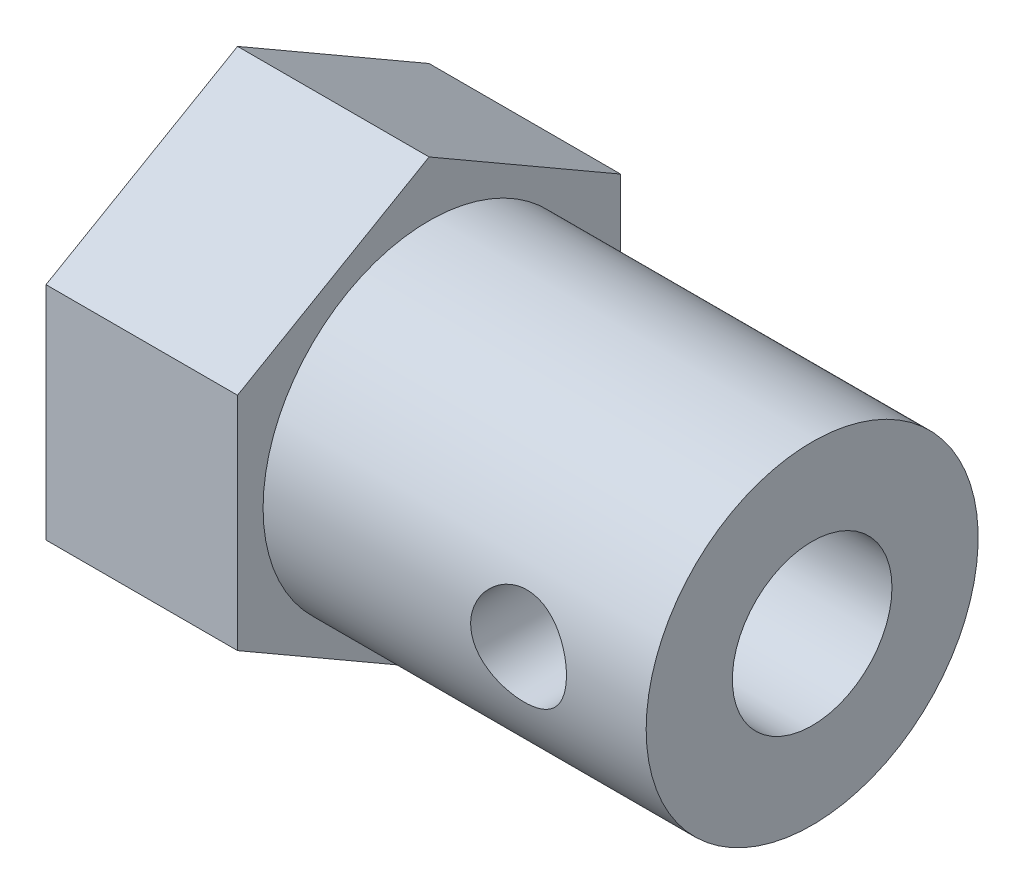
ISO-10303-21;
HEADER;
FILE_DESCRIPTION(('STEP AP214'),'2;1');
FILE_NAME('part.step','',(''),(''),'','','');
FILE_SCHEMA(('AUTOMOTIVE_DESIGN { 1 0 10303 214 1 1 1 1 }'));
ENDSEC;
DATA;
#1=APPLICATION_CONTEXT('core data for automotive mechanical design processes');
#2=APPLICATION_PROTOCOL_DEFINITION('international standard','automotive_design',2000,#1);
#3=PRODUCT_CONTEXT('',#1,'mechanical');
#4=PRODUCT('Part','Part','',(#3));
#5=PRODUCT_RELATED_PRODUCT_CATEGORY('part','',(#4));
#6=PRODUCT_DEFINITION_FORMATION('','',#4);
#7=PRODUCT_DEFINITION_CONTEXT('part definition',#1,'design');
#8=PRODUCT_DEFINITION('design','',#6,#7);
#9=PRODUCT_DEFINITION_SHAPE('','',#8);
#10=(LENGTH_UNIT() NAMED_UNIT(*) SI_UNIT(.MILLI.,.METRE.));
#11=(NAMED_UNIT(*) PLANE_ANGLE_UNIT() SI_UNIT($,.RADIAN.));
#12=(NAMED_UNIT(*) SI_UNIT($,.STERADIAN.) SOLID_ANGLE_UNIT());
#13=UNCERTAINTY_MEASURE_WITH_UNIT(LENGTH_MEASURE(1.E-05),#10,'distance_accuracy_value','');
#14=(GEOMETRIC_REPRESENTATION_CONTEXT(3) GLOBAL_UNCERTAINTY_ASSIGNED_CONTEXT((#13)) GLOBAL_UNIT_ASSIGNED_CONTEXT((#10,
#11,#12)) REPRESENTATION_CONTEXT('',''));
#15=CARTESIAN_POINT('',(0.,0.,0.));
#16=DIRECTION('',(0.,0.,1.));
#17=DIRECTION('',(1.,0.,0.));
#18=AXIS2_PLACEMENT_3D('',#15,#16,#17);
#19=CARTESIAN_POINT('',(-82.,-73.4641016151378,-39.5));
#20=DIRECTION('',(0.,-0.86602540378444,-0.499999999999997));
#21=DIRECTION('',(0.,0.499999999999997,-0.86602540378444));
#22=AXIS2_PLACEMENT_3D('',#19,#20,#21);
#23=PLANE('',#22);
#24=DIRECTION('',(0.,-0.499999999999997,0.86602540378444));
#25=VECTOR('',#24,1.);
#26=CARTESIAN_POINT('',(-88.,-73.4641016151378,-39.5));
#27=LINE('',#26,#25);
#28=CARTESIAN_POINT('',(-88.,-73.4641016151378,-39.5));
#29=VERTEX_POINT('',#28);
#30=CARTESIAN_POINT('',(-88.,-76.9282032302755,-33.5));
#31=VERTEX_POINT('',#30);
#32=EDGE_CURVE('E122',#29,#31,#27,.T.);
#33=ORIENTED_EDGE('',*,*,#32,.F.);
#34=DIRECTION('',(-1.,0.,0.));
#35=VECTOR('',#34,1.);
#36=CARTESIAN_POINT('',(-82.,-73.4641016151378,-39.5));
#37=LINE('',#36,#35);
#38=CARTESIAN_POINT('',(-82.,-73.4641016151378,-39.5));
#39=VERTEX_POINT('',#38);
#40=EDGE_CURVE('E11',#39,#29,#37,.T.);
#41=ORIENTED_EDGE('',*,*,#40,.F.);
#42=DIRECTION('',(0.,-0.499999999999997,0.86602540378444));
#43=VECTOR('',#42,1.);
#44=CARTESIAN_POINT('',(-82.,-73.4641016151378,-39.5));
#45=LINE('',#44,#43);
#46=CARTESIAN_POINT('',(-82.,-76.9282032302755,-33.5));
#47=VERTEX_POINT('',#46);
#48=EDGE_CURVE('E137',#39,#47,#45,.T.);
#49=ORIENTED_EDGE('',*,*,#48,.T.);
#50=DIRECTION('',(-1.,0.,0.));
#51=VECTOR('',#50,1.);
#52=CARTESIAN_POINT('',(-82.,-76.9282032302755,-33.5));
#53=LINE('',#52,#51);
#54=EDGE_CURVE('E86',#47,#31,#53,.T.);
#55=ORIENTED_EDGE('',*,*,#54,.T.);
#56=EDGE_LOOP('',(#33,#41,#49,#55));
#57=FACE_BOUND('',#56,.T.);
#58=ADVANCED_FACE('F32',(#57),#23,.T.);
#59=CARTESIAN_POINT('',(-82.,-66.5358983848623,-39.5));
#60=DIRECTION('',(0.,0.,-1.));
#61=DIRECTION('',(0.,1.,0.));
#62=AXIS2_PLACEMENT_3D('',#59,#60,#61);
#63=PLANE('',#62);
#64=DIRECTION('',(0.,-1.,0.));
#65=VECTOR('',#64,1.);
#66=CARTESIAN_POINT('',(-88.,-66.5358983848623,-39.5));
#67=LINE('',#66,#65);
#68=CARTESIAN_POINT('',(-88.,-66.5358983848623,-39.5));
#69=VERTEX_POINT('',#68);
#70=EDGE_CURVE('E135',#69,#29,#67,.T.);
#71=ORIENTED_EDGE('',*,*,#70,.F.);
#72=DIRECTION('',(-1.,0.,0.));
#73=VECTOR('',#72,1.);
#74=CARTESIAN_POINT('',(-82.,-66.5358983848623,-39.5));
#75=LINE('',#74,#73);
#76=CARTESIAN_POINT('',(-82.,-66.5358983848623,-39.5));
#77=VERTEX_POINT('',#76);
#78=EDGE_CURVE('E45',#77,#69,#75,.T.);
#79=ORIENTED_EDGE('',*,*,#78,.F.);
#80=DIRECTION('',(0.,-1.,0.));
#81=VECTOR('',#80,1.);
#82=CARTESIAN_POINT('',(-82.,-66.5358983848623,-39.5));
#83=LINE('',#82,#81);
#84=EDGE_CURVE('E112',#77,#39,#83,.T.);
#85=ORIENTED_EDGE('',*,*,#84,.T.);
#86=ORIENTED_EDGE('',*,*,#40,.T.);
#87=EDGE_LOOP('',(#71,#79,#85,#86));
#88=FACE_BOUND('',#87,.T.);
#89=ADVANCED_FACE('F146',(#88),#63,.T.);
#90=CARTESIAN_POINT('',(-82.,-63.0717967697245,-33.5));
#91=DIRECTION('',(0.,0.866025403784437,-0.500000000000003));
#92=DIRECTION('',(0.,0.500000000000003,0.866025403784437));
#93=AXIS2_PLACEMENT_3D('',#90,#91,#92);
#94=PLANE('',#93);
#95=DIRECTION('',(0.,-0.500000000000002,-0.866025403784437));
#96=VECTOR('',#95,1.);
#97=CARTESIAN_POINT('',(-88.,-63.0717967697245,-33.5));
#98=LINE('',#97,#96);
#99=CARTESIAN_POINT('',(-88.,-63.0717967697245,-33.5));
#100=VERTEX_POINT('',#99);
#101=EDGE_CURVE('E99',#100,#69,#98,.T.);
#102=ORIENTED_EDGE('',*,*,#101,.F.);
#103=DIRECTION('',(-1.,0.,0.));
#104=VECTOR('',#103,1.);
#105=CARTESIAN_POINT('',(-82.,-63.0717967697245,-33.5));
#106=LINE('',#105,#104);
#107=CARTESIAN_POINT('',(-82.,-63.0717967697245,-33.5));
#108=VERTEX_POINT('',#107);
#109=EDGE_CURVE('E94',#108,#100,#106,.T.);
#110=ORIENTED_EDGE('',*,*,#109,.F.);
#111=DIRECTION('',(0.,-0.500000000000002,-0.866025403784437));
#112=VECTOR('',#111,1.);
#113=CARTESIAN_POINT('',(-82.,-63.0717967697245,-33.5));
#114=LINE('',#113,#112);
#115=EDGE_CURVE('E97',#108,#77,#114,.T.);
#116=ORIENTED_EDGE('',*,*,#115,.T.);
#117=ORIENTED_EDGE('',*,*,#78,.T.);
#118=EDGE_LOOP('',(#102,#110,#116,#117));
#119=FACE_BOUND('',#118,.T.);
#120=ADVANCED_FACE('F96',(#119),#94,.T.);
#121=CARTESIAN_POINT('',(-82.,-66.5358983848623,-27.5));
#122=DIRECTION('',(0.,0.866025403784438,0.500000000000001));
#123=DIRECTION('',(0.,-0.500000000000001,0.866025403784438));
#124=AXIS2_PLACEMENT_3D('',#121,#122,#123);
#125=PLANE('',#124);
#126=DIRECTION('',(0.,0.500000000000001,-0.866025403784438));
#127=VECTOR('',#126,1.);
#128=CARTESIAN_POINT('',(-88.,-66.5358983848623,-27.5));
#129=LINE('',#128,#127);
#130=CARTESIAN_POINT('',(-88.,-66.5358983848623,-27.5));
#131=VERTEX_POINT('',#130);
#132=EDGE_CURVE('E132',#131,#100,#129,.T.);
#133=ORIENTED_EDGE('',*,*,#132,.F.);
#134=DIRECTION('',(-1.,0.,0.));
#135=VECTOR('',#134,1.);
#136=CARTESIAN_POINT('',(-82.,-66.5358983848623,-27.5));
#137=LINE('',#136,#135);
#138=CARTESIAN_POINT('',(-82.,-66.5358983848623,-27.5));
#139=VERTEX_POINT('',#138);
#140=EDGE_CURVE('E104',#139,#131,#137,.T.);
#141=ORIENTED_EDGE('',*,*,#140,.F.);
#142=DIRECTION('',(0.,0.500000000000001,-0.866025403784438));
#143=VECTOR('',#142,1.);
#144=CARTESIAN_POINT('',(-82.,-66.5358983848623,-27.5));
#145=LINE('',#144,#143);
#146=EDGE_CURVE('E110',#139,#108,#145,.T.);
#147=ORIENTED_EDGE('',*,*,#146,.T.);
#148=ORIENTED_EDGE('',*,*,#109,.T.);
#149=EDGE_LOOP('',(#133,#141,#147,#148));
#150=FACE_BOUND('',#149,.T.);
#151=ADVANCED_FACE('F114',(#150),#125,.T.);
#152=CARTESIAN_POINT('',(-82.,-73.4641016151378,-27.5));
#153=DIRECTION('',(0.,0.,1.));
#154=DIRECTION('',(0.,-1.,0.));
#155=AXIS2_PLACEMENT_3D('',#152,#153,#154);
#156=PLANE('',#155);
#157=DIRECTION('',(0.,1.,0.));
#158=VECTOR('',#157,1.);
#159=CARTESIAN_POINT('',(-88.,-73.4641016151378,-27.5));
#160=LINE('',#159,#158);
#161=CARTESIAN_POINT('',(-88.,-73.4641016151378,-27.5));
#162=VERTEX_POINT('',#161);
#163=EDGE_CURVE('E129',#162,#131,#160,.T.);
#164=ORIENTED_EDGE('',*,*,#163,.F.);
#165=DIRECTION('',(-1.,0.,0.));
#166=VECTOR('',#165,1.);
#167=CARTESIAN_POINT('',(-82.,-73.4641016151378,-27.5));
#168=LINE('',#167,#166);
#169=CARTESIAN_POINT('',(-82.,-73.4641016151378,-27.5));
#170=VERTEX_POINT('',#169);
#171=EDGE_CURVE('E141',#170,#162,#168,.T.);
#172=ORIENTED_EDGE('',*,*,#171,.F.);
#173=DIRECTION('',(0.,1.,0.));
#174=VECTOR('',#173,1.);
#175=CARTESIAN_POINT('',(-82.,-73.4641016151378,-27.5));
#176=LINE('',#175,#174);
#177=EDGE_CURVE('E115',#170,#139,#176,.T.);
#178=ORIENTED_EDGE('',*,*,#177,.T.);
#179=ORIENTED_EDGE('',*,*,#140,.T.);
#180=EDGE_LOOP('',(#164,#172,#178,#179));
#181=FACE_BOUND('',#180,.T.);
#182=ADVANCED_FACE('F159',(#181),#156,.T.);
#183=CARTESIAN_POINT('',(-82.,-76.9282032302755,-33.5));
#184=DIRECTION('',(0.,-0.866025403784441,0.499999999999996));
#185=DIRECTION('',(0.,-0.499999999999996,-0.866025403784441));
#186=AXIS2_PLACEMENT_3D('',#183,#184,#185);
#187=PLANE('',#186);
#188=DIRECTION('',(0.,0.499999999999996,0.866025403784441));
#189=VECTOR('',#188,1.);
#190=CARTESIAN_POINT('',(-88.,-76.9282032302755,-33.5));
#191=LINE('',#190,#189);
#192=EDGE_CURVE('E125',#31,#162,#191,.T.);
#193=ORIENTED_EDGE('',*,*,#192,.F.);
#194=ORIENTED_EDGE('',*,*,#54,.F.);
#195=DIRECTION('',(0.,0.499999999999996,0.866025403784441));
#196=VECTOR('',#195,1.);
#197=CARTESIAN_POINT('',(-82.,-76.9282032302755,-33.5));
#198=LINE('',#197,#196);
#199=EDGE_CURVE('E117',#47,#170,#198,.T.);
#200=ORIENTED_EDGE('',*,*,#199,.T.);
#201=ORIENTED_EDGE('',*,*,#171,.T.);
#202=EDGE_LOOP('',(#193,#194,#200,#201));
#203=FACE_BOUND('',#202,.T.);
#204=ADVANCED_FACE('F142',(#203),#187,.T.);
#205=CARTESIAN_POINT('',(-82.,0.,0.));
#206=DIRECTION('',(-1.,0.,0.));
#207=DIRECTION('',(0.,0.,1.));
#208=AXIS2_PLACEMENT_3D('',#205,#206,#207);
#209=PLANE('',#208);
#210=CARTESIAN_POINT('',(-82.,-70.,-33.5));
#211=DIRECTION('',(-1.,0.,0.));
#212=DIRECTION('',(0.,0.,1.));
#213=AXIS2_PLACEMENT_3D('',#210,#211,#212);
#214=CIRCLE('',#213,5.2);
#215=CARTESIAN_POINT('',(-82.,-70.,-28.3));
#216=VERTEX_POINT('',#215);
#217=EDGE_CURVE('E217',#216,#216,#214,.T.);
#218=ORIENTED_EDGE('',*,*,#217,.T.);
#219=EDGE_LOOP('',(#218));
#220=FACE_BOUND('',#219,.T.);
#221=ORIENTED_EDGE('',*,*,#48,.F.);
#222=ORIENTED_EDGE('',*,*,#84,.F.);
#223=ORIENTED_EDGE('',*,*,#115,.F.);
#224=ORIENTED_EDGE('',*,*,#146,.F.);
#225=ORIENTED_EDGE('',*,*,#177,.F.);
#226=ORIENTED_EDGE('',*,*,#199,.F.);
#227=EDGE_LOOP('',(#221,#222,#223,#224,#225,#226));
#228=FACE_BOUND('',#227,.T.);
#229=ADVANCED_FACE('F108',(#220,#228),#209,.F.);
#230=CARTESIAN_POINT('',(-88.,0.,0.));
#231=DIRECTION('',(-1.,0.,0.));
#232=DIRECTION('',(0.,0.,1.));
#233=AXIS2_PLACEMENT_3D('',#230,#231,#232);
#234=PLANE('',#233);
#235=CARTESIAN_POINT('',(-88.,-70.,-33.5));
#236=DIRECTION('',(1.,0.,0.));
#237=DIRECTION('',(0.,0.,-1.));
#238=AXIS2_PLACEMENT_3D('',#235,#236,#237);
#239=CIRCLE('',#238,2.);
#240=CARTESIAN_POINT('',(-88.,-70.,-35.5));
#241=VERTEX_POINT('',#240);
#242=EDGE_CURVE('E211',#241,#241,#239,.T.);
#243=ORIENTED_EDGE('',*,*,#242,.T.);
#244=EDGE_LOOP('',(#243));
#245=FACE_BOUND('',#244,.T.);
#246=ORIENTED_EDGE('',*,*,#32,.T.);
#247=ORIENTED_EDGE('',*,*,#192,.T.);
#248=ORIENTED_EDGE('',*,*,#163,.T.);
#249=ORIENTED_EDGE('',*,*,#132,.T.);
#250=ORIENTED_EDGE('',*,*,#101,.T.);
#251=ORIENTED_EDGE('',*,*,#70,.T.);
#252=EDGE_LOOP('',(#246,#247,#248,#249,#250,#251));
#253=FACE_BOUND('',#252,.T.);
#254=ADVANCED_FACE('F145',(#245,#253),#234,.T.);
#255=CARTESIAN_POINT('',(-70.,-70.,-33.5));
#256=DIRECTION('',(-1.,0.,0.));
#257=DIRECTION('',(0.,0.,1.));
#258=AXIS2_PLACEMENT_3D('',#255,#256,#257);
#259=CYLINDRICAL_SURFACE('',#258,5.2);
#260=CARTESIAN_POINT('',(-72.5075734128847,-70.,-28.3));
#261=CARTESIAN_POINT('',(-72.4993298792375,-69.9182634320137,-28.3000009519643));
#262=CARTESIAN_POINT('',(-72.4978193369039,-69.8358344879732,-28.3019457847133));
#263=CARTESIAN_POINT('',(-72.5082716435564,-69.6720088682041,-28.3097058460094));
#264=CARTESIAN_POINT('',(-72.5202383669136,-69.5906124961177,-28.3155221873202));
#265=CARTESIAN_POINT('',(-72.5571550520366,-69.4312727250517,-28.3305755782491));
#266=CARTESIAN_POINT('',(-72.5820883933892,-69.3533250440489,-28.3398082445139));
#267=CARTESIAN_POINT('',(-72.6440961947241,-69.2028101877803,-28.3609075797076));
#268=CARTESIAN_POINT('',(-72.6811721135689,-69.1302436603152,-28.3727745650798));
#269=CARTESIAN_POINT('',(-72.767395763415,-68.9906363829018,-28.3983979813537));
#270=CARTESIAN_POINT('',(-72.8168053804033,-68.9237644177519,-28.4121920895569));
#271=CARTESIAN_POINT('',(-72.9259265277117,-68.7991099694335,-28.4401629153205));
#272=CARTESIAN_POINT('',(-72.9856403544675,-68.7413295179341,-28.4543397175743));
#273=CARTESIAN_POINT('',(-73.1158970052376,-68.6346905347093,-28.4821254974626));
#274=CARTESIAN_POINT('',(-73.1867159923318,-68.5861603504464,-28.4957036828833));
#275=CARTESIAN_POINT('',(-73.3359309835328,-68.501735228831,-28.5203267737046));
#276=CARTESIAN_POINT('',(-73.414325899353,-68.4658384801068,-28.5313720421937));
#277=CARTESIAN_POINT('',(-73.5749483597456,-68.4084650018825,-28.549453528997));
#278=CARTESIAN_POINT('',(-73.6570725132625,-68.3867229192904,-28.5565631225927));
#279=CARTESIAN_POINT('',(-73.8240628760497,-68.357403907035,-28.5662262452633));
#280=CARTESIAN_POINT('',(-73.9089280811859,-68.3498218486578,-28.5687814239168));
#281=CARTESIAN_POINT('',(-74.0747696866836,-68.3491359941443,-28.5690118712684));
#282=CARTESIAN_POINT('',(-74.1557438839963,-68.3553769648612,-28.5669079876016));
#283=CARTESIAN_POINT('',(-74.3154122253626,-68.3807681259345,-28.558516013389));
#284=CARTESIAN_POINT('',(-74.3941063433833,-68.399918463625,-28.5522278750885));
#285=CARTESIAN_POINT('',(-74.5467840319952,-68.4503619109974,-28.5361997803083));
#286=CARTESIAN_POINT('',(-74.6207838460067,-68.4816101523025,-28.526472589929));
#287=CARTESIAN_POINT('',(-74.7625875311605,-68.5552984808986,-28.5045711180459));
#288=CARTESIAN_POINT('',(-74.8303899919915,-68.5977411071629,-28.492396281546));
#289=CARTESIAN_POINT('',(-74.9610772937281,-68.6947965249418,-28.4662068204427));
#290=CARTESIAN_POINT('',(-75.0236136246701,-68.7498633077623,-28.4521347543961));
#291=CARTESIAN_POINT('',(-75.1387407736417,-68.8695760431771,-28.4239859992678));
#292=CARTESIAN_POINT('',(-75.1913295444502,-68.9342239627102,-28.4099093098305));
#293=CARTESIAN_POINT('',(-75.2865519189589,-69.0735064376879,-28.3826980064286));
#294=CARTESIAN_POINT('',(-75.3288560127592,-69.1483745916909,-28.3696020895844));
#295=CARTESIAN_POINT('',(-75.4001735108643,-69.3045888943866,-28.3461051282536));
#296=CARTESIAN_POINT('',(-75.4291892374571,-69.3859339082578,-28.3357036130288));
#297=CARTESIAN_POINT('',(-75.4723834739865,-69.5508274259633,-28.3187887884473));
#298=CARTESIAN_POINT('',(-75.4868911035547,-69.6342807979608,-28.3121907415722));
#299=CARTESIAN_POINT('',(-75.5016477967056,-69.8026519909913,-28.3030629775006));
#300=CARTESIAN_POINT('',(-75.5019003069684,-69.8875694530615,-28.3005322770226));
#301=CARTESIAN_POINT('',(-75.488335981995,-70.0532060426736,-28.2996359392437));
#302=CARTESIAN_POINT('',(-75.4750246678558,-70.1339663454067,-28.3011238231642));
#303=CARTESIAN_POINT('',(-75.4355127973925,-70.2921166067928,-28.3076080483169));
#304=CARTESIAN_POINT('',(-75.4093120411518,-70.3695065131504,-28.312604443967));
#305=CARTESIAN_POINT('',(-75.3447690351744,-70.5189630345858,-28.3254159232352));
#306=CARTESIAN_POINT('',(-75.3064028523728,-70.5910188081935,-28.3332365672504));
#307=CARTESIAN_POINT('',(-75.2186414938878,-70.7278204313877,-28.3507243157307));
#308=CARTESIAN_POINT('',(-75.1692442086805,-70.7925648792283,-28.3603917733185));
#309=CARTESIAN_POINT('',(-75.0589512096226,-70.9151199743544,-28.3807673234403));
#310=CARTESIAN_POINT('',(-74.9977355373466,-70.9726389856765,-28.3914989472727));
#311=CARTESIAN_POINT('',(-74.8665133828782,-71.076718744885,-28.4124168585395));
#312=CARTESIAN_POINT('',(-74.796505942526,-71.1232782967762,-28.4226030863618));
#313=CARTESIAN_POINT('',(-74.6484971366533,-71.2046998482239,-28.4412971565609));
#314=CARTESIAN_POINT('',(-74.5703994627103,-71.2393929991245,-28.4497801153196));
#315=CARTESIAN_POINT('',(-74.4092133468257,-71.2950757134024,-28.4637701445175));
#316=CARTESIAN_POINT('',(-74.326126013605,-71.3160683088807,-28.4692778733651));
#317=CARTESIAN_POINT('',(-74.1595996399537,-71.3432658805692,-28.4764721947487));
#318=CARTESIAN_POINT('',(-74.0762245004089,-71.3498369847257,-28.4782533401788));
#319=CARTESIAN_POINT('',(-73.9095516499582,-71.3490453731705,-28.4780404685475));
#320=CARTESIAN_POINT('',(-73.826253930937,-71.3416843353469,-28.4760469060853));
#321=CARTESIAN_POINT('',(-73.6639328952997,-71.313596655444,-28.4686319547742));
#322=CARTESIAN_POINT('',(-73.5848564646598,-71.2931554691473,-28.4632838228135));
#323=CARTESIAN_POINT('',(-73.4312601483998,-71.2398342634223,-28.4498949224986));
#324=CARTESIAN_POINT('',(-73.3567407986349,-71.2069527844273,-28.4418538382044));
#325=CARTESIAN_POINT('',(-73.2127638972418,-71.1289474982784,-28.4238691663597));
#326=CARTESIAN_POINT('',(-73.1434329389901,-71.0835980850996,-28.4138916269598));
#327=CARTESIAN_POINT('',(-73.0132021581083,-70.9821736780341,-28.3933370609873));
#328=CARTESIAN_POINT('',(-72.9523044462624,-70.9260960072717,-28.3827598852602));
#329=CARTESIAN_POINT('',(-72.8389416309806,-70.8029459968074,-28.3619772562862));
#330=CARTESIAN_POINT('',(-72.7867565508126,-70.735612323876,-28.3517901923015));
#331=CARTESIAN_POINT('',(-72.6944371505531,-70.5929094837232,-28.3334131628879));
#332=CARTESIAN_POINT('',(-72.6542976402083,-70.5175437963995,-28.3252223375966));
#333=CARTESIAN_POINT('',(-72.5910183931813,-70.3695660749258,-28.3126779205736));
#334=CARTESIAN_POINT('',(-72.5664883177226,-70.297573386017,-28.307999833398));
#335=CARTESIAN_POINT('',(-72.5285784332982,-70.1505841878243,-28.3016606730991));
#336=CARTESIAN_POINT('',(-72.5151968493104,-70.0755881587147,-28.2999991196446));
#337=CARTESIAN_POINT('',(-72.5075734128847,-70.,-28.3));
#338=B_SPLINE_CURVE_WITH_KNOTS('',3,(#260,#261,#262,#263,#264,#265,#266,#267,#268,#269,#270,
#271,#272,#273,#274,#275,#276,#277,#278,#279,#280,#281,#282,#283,#284,#285,#286,#287,#288,#289,
#290,#291,#292,#293,#294,#295,#296,#297,#298,#299,#300,#301,#302,#303,#304,#305,#306,#307,#308,
#309,#310,#311,#312,#313,#314,#315,#316,#317,#318,#319,#320,#321,#322,#323,#324,#325,#326,#327,
#328,#329,#330,#331,#332,#333,#334,#335,#336,#337),.UNSPECIFIED.,.T.,.F.,(4,2,2,2,2,2,2,2,2,2,2,
2,2,2,2,2,2,2,2,2,2,2,2,2,2,2,2,2,2,2,2,2,2,2,2,2,2,2,4),(0.,0.246177147406853,
0.492425082551785,0.738358155979173,0.984320787725976,1.23603197074443,1.48779932370231,
1.74729567247902,2.00675479970487,2.26119804642442,2.51554911675867,2.75810262474976,
3.00065890104039,3.24232407817626,3.48404411405312,3.73641912362575,3.98884601593168,
4.24852689318968,4.50816237102915,4.76176442003742,5.01530515150247,5.25973011078872,
5.50415886125106,5.74907149180777,5.99403099820054,6.24690549439466,6.49980757375484,
6.75617155417276,7.01247877883844,7.26219981404977,7.51189077654699,7.75631025962372,
8.0007584282962,8.24995959517465,8.4992230231097,8.75538500500198,9.0114364515729,
9.23913185764595,9.4667910039567),.UNSPECIFIED.);
#339=CARTESIAN_POINT('',(-72.5075734128847,-70.,-28.3));
#340=VERTEX_POINT('',#339);
#341=EDGE_CURVE('E181',#340,#340,#338,.T.);
#342=ORIENTED_EDGE('',*,*,#341,.F.);
#343=EDGE_LOOP('',(#342));
#344=FACE_BOUND('',#343,.T.);
#345=CARTESIAN_POINT('',(-70.,-70.,-33.5));
#346=DIRECTION('',(-1.,0.,0.));
#347=DIRECTION('',(0.,0.,1.));
#348=AXIS2_PLACEMENT_3D('',#345,#346,#347);
#349=CIRCLE('',#348,5.2);
#350=CARTESIAN_POINT('',(-70.,-70.,-28.3));
#351=VERTEX_POINT('',#350);
#352=EDGE_CURVE('E126',#351,#351,#349,.T.);
#353=ORIENTED_EDGE('',*,*,#352,.T.);
#354=EDGE_LOOP('',(#353));
#355=FACE_BOUND('',#354,.T.);
#356=ORIENTED_EDGE('',*,*,#217,.F.);
#357=EDGE_LOOP('',(#356));
#358=FACE_BOUND('',#357,.T.);
#359=ADVANCED_FACE('F170',(#344,#355,#358),#259,.T.);
#360=CARTESIAN_POINT('',(-70.,-64.8,-33.5));
#361=DIRECTION('',(1.,0.,0.));
#362=DIRECTION('',(0.,0.,-1.));
#363=AXIS2_PLACEMENT_3D('',#360,#361,#362);
#364=PLANE('',#363);
#365=CARTESIAN_POINT('',(-70.,-70.,-33.5));
#366=DIRECTION('',(1.,0.,0.));
#367=DIRECTION('',(0.,0.,-1.));
#368=AXIS2_PLACEMENT_3D('',#365,#366,#367);
#369=CIRCLE('',#368,2.49999999999999);
#370=CARTESIAN_POINT('',(-70.,-70.,-36.));
#371=VERTEX_POINT('',#370);
#372=EDGE_CURVE('E186',#371,#371,#369,.T.);
#373=ORIENTED_EDGE('',*,*,#372,.F.);
#374=EDGE_LOOP('',(#373));
#375=FACE_BOUND('',#374,.T.);
#376=ORIENTED_EDGE('',*,*,#352,.F.);
#377=EDGE_LOOP('',(#376));
#378=FACE_BOUND('',#377,.T.);
#379=ADVANCED_FACE('F177',(#375,#378),#364,.T.);
#380=CARTESIAN_POINT('',(-70.,-70.,-33.5));
#381=DIRECTION('',(1.,0.,0.));
#382=DIRECTION('',(0.,0.,-1.));
#383=AXIS2_PLACEMENT_3D('',#380,#381,#382);
#384=CYLINDRICAL_SURFACE('',#383,2.00000000000001);
#385=ORIENTED_EDGE('',*,*,#242,.F.);
#386=EDGE_LOOP('',(#385));
#387=FACE_BOUND('',#386,.T.);
#388=CARTESIAN_POINT('',(-82.,-70.,-33.5));
#389=DIRECTION('',(1.,0.,0.));
#390=DIRECTION('',(0.,0.,-1.));
#391=AXIS2_PLACEMENT_3D('',#388,#389,#390);
#392=CIRCLE('',#391,2.00000000000002);
#393=CARTESIAN_POINT('',(-82.,-70.,-35.5));
#394=VERTEX_POINT('',#393);
#395=EDGE_CURVE('E214',#394,#394,#392,.T.);
#396=ORIENTED_EDGE('',*,*,#395,.T.);
#397=EDGE_LOOP('',(#396));
#398=FACE_BOUND('',#397,.T.);
#399=ADVANCED_FACE('F200',(#387,#398),#384,.F.);
#400=CARTESIAN_POINT('',(-82.,-68.,-33.5));
#401=DIRECTION('',(-1.,0.,0.));
#402=DIRECTION('',(0.,0.,1.));
#403=AXIS2_PLACEMENT_3D('',#400,#401,#402);
#404=PLANE('',#403);
#405=ORIENTED_EDGE('',*,*,#395,.F.);
#406=EDGE_LOOP('',(#405));
#407=FACE_BOUND('',#406,.T.);
#408=CARTESIAN_POINT('',(-82.,-70.,-33.5));
#409=DIRECTION('',(1.,0.,0.));
#410=DIRECTION('',(0.,0.,-1.));
#411=AXIS2_PLACEMENT_3D('',#408,#409,#410);
#412=CIRCLE('',#411,2.49999999999999);
#413=CARTESIAN_POINT('',(-82.,-70.,-36.));
#414=VERTEX_POINT('',#413);
#415=EDGE_CURVE('E215',#414,#414,#412,.T.);
#416=ORIENTED_EDGE('',*,*,#415,.T.);
#417=EDGE_LOOP('',(#416));
#418=FACE_BOUND('',#417,.T.);
#419=ADVANCED_FACE('F197',(#407,#418),#404,.F.);
#420=CARTESIAN_POINT('',(-70.,-70.,-33.5));
#421=DIRECTION('',(1.,0.,0.));
#422=DIRECTION('',(0.,0.,-1.));
#423=AXIS2_PLACEMENT_3D('',#420,#421,#422);
#424=CYLINDRICAL_SURFACE('',#423,2.49999999999999);
#425=CARTESIAN_POINT('',(-75.5,-69.8494580388352,-31.0045366927305));
#426=CARTESIAN_POINT('',(-75.5000017003391,-69.925076438579,-30.9999732277463));
#427=CARTESIAN_POINT('',(-75.4942552251699,-70.0008969628287,-30.9988791030365));
#428=CARTESIAN_POINT('',(-75.4714096925992,-70.1506023621213,-31.0034166284042));
#429=CARTESIAN_POINT('',(-75.4543085925377,-70.2244868863979,-31.0090494887902));
#430=CARTESIAN_POINT('',(-75.4095373184378,-70.3679540227697,-31.0261731972603));
#431=CARTESIAN_POINT('',(-75.3819020622469,-70.4375499743074,-31.0376447333994));
#432=CARTESIAN_POINT('',(-75.3170787178196,-70.5711381263295,-31.0651572596099));
#433=CARTESIAN_POINT('',(-75.2798879912494,-70.6351287725951,-31.0811995118223));
#434=CARTESIAN_POINT('',(-75.1944879017164,-70.76010221201,-31.1174105354693));
#435=CARTESIAN_POINT('',(-75.1457445255676,-70.8206629777794,-31.1377714193983));
#436=CARTESIAN_POINT('',(-75.0398099599321,-70.9333325637032,-31.179974887042));
#437=CARTESIAN_POINT('',(-74.9826119120246,-70.9854344493394,-31.2018186658268));
#438=CARTESIAN_POINT('',(-74.8536347672318,-71.0858809364131,-31.2473914196765));
#439=CARTESIAN_POINT('',(-74.7809336050541,-71.1330846906727,-31.2710443597218));
#440=CARTESIAN_POINT('',(-74.627541927318,-71.2146418143442,-31.3144137329319));
#441=CARTESIAN_POINT('',(-74.5468539655061,-71.2489992746268,-31.3341314183347));
#442=CARTESIAN_POINT('',(-74.3819524428745,-71.3025168228448,-31.3658958204659));
#443=CARTESIAN_POINT('',(-74.2979272889753,-71.3221174154489,-31.378162574597));
#444=CARTESIAN_POINT('',(-74.1269922953914,-71.3465534386481,-31.3935758669662));
#445=CARTESIAN_POINT('',(-74.0400873568875,-71.3514127721699,-31.3967371692579));
#446=CARTESIAN_POINT('',(-73.8800159741259,-71.3464663780251,-31.3935770220674));
#447=CARTESIAN_POINT('',(-73.8067457488963,-71.3387528205638,-31.3886079843123));
#448=CARTESIAN_POINT('',(-73.662777291422,-71.3128898270247,-31.372430908664));
#449=CARTESIAN_POINT('',(-73.5920802981112,-71.2947354328592,-31.3612199067016));
#450=CARTESIAN_POINT('',(-73.4546507894492,-71.2486979156566,-31.3340214761279));
#451=CARTESIAN_POINT('',(-73.3879340143003,-71.2207788230437,-31.3180164197096));
#452=CARTESIAN_POINT('',(-73.2597951472872,-71.1560774301631,-31.2830570803221));
#453=CARTESIAN_POINT('',(-73.198375258934,-71.1192914651855,-31.264101579074));
#454=CARTESIAN_POINT('',(-73.0727219504481,-71.0313612164167,-31.2220597848826));
#455=CARTESIAN_POINT('',(-73.0094811835287,-70.9788841181241,-31.1987836897361));
#456=CARTESIAN_POINT('',(-72.8921659331394,-70.864073745774,-31.1532590897936));
#457=CARTESIAN_POINT('',(-72.8380975912677,-70.8017339214677,-31.1310112807044));
#458=CARTESIAN_POINT('',(-72.7374793988266,-70.6641563035477,-31.0886976092689));
#459=CARTESIAN_POINT('',(-72.6915892676953,-70.5883637366043,-31.0688475961826));
#460=CARTESIAN_POINT('',(-72.6135193026588,-70.4287178192956,-31.0356907131772));
#461=CARTESIAN_POINT('',(-72.5813246048762,-70.3448733296253,-31.0223767471489));
#462=CARTESIAN_POINT('',(-72.5348337221552,-70.180808762473,-31.0053262686176));
#463=CARTESIAN_POINT('',(-72.5190372684322,-70.1011027906427,-31.000745572285));
#464=CARTESIAN_POINT('',(-72.5005575944913,-69.9401365729498,-30.9994244971836));
#465=CARTESIAN_POINT('',(-72.49786635793,-69.8588773077729,-31.0026793236746));
#466=CARTESIAN_POINT('',(-72.5051353828366,-69.7056447229687,-31.0163148871389));
#467=CARTESIAN_POINT('',(-72.5138798228087,-69.6335427941493,-31.0259648590971));
#468=CARTESIAN_POINT('',(-72.5413595516411,-69.4923245430547,-31.0510388897864));
#469=CARTESIAN_POINT('',(-72.5600964878316,-69.4232087150899,-31.0664639004465));
#470=CARTESIAN_POINT('',(-72.6074936627736,-69.287040961871,-31.1027441742882));
#471=CARTESIAN_POINT('',(-72.6364872362439,-69.220153222501,-31.1237751266204));
#472=CARTESIAN_POINT('',(-72.703124940987,-69.0922793047115,-31.1696214240463));
#473=CARTESIAN_POINT('',(-72.7407713544712,-69.0312946892994,-31.1944377669657));
#474=CARTESIAN_POINT('',(-72.8295394216992,-68.9078745768751,-31.2500103191055));
#475=CARTESIAN_POINT('',(-72.8818075278097,-68.8464196240658,-31.2811124485156));
#476=CARTESIAN_POINT('',(-72.995346802775,-68.732702525415,-31.3440332148944));
#477=CARTESIAN_POINT('',(-73.0566343230988,-68.6804574626261,-31.3758530623947));
#478=CARTESIAN_POINT('',(-73.195381991855,-68.580293248286,-31.4412583302488));
#479=CARTESIAN_POINT('',(-73.273901615654,-68.5336611654161,-31.4745919604095));
#480=CARTESIAN_POINT('',(-73.4402766036447,-68.4547821383829,-31.5341017166685));
#481=CARTESIAN_POINT('',(-73.5281034824078,-68.4224927871895,-31.5602988531398));
#482=CARTESIAN_POINT('',(-73.6815843801467,-68.382236452976,-31.5938798038363));
#483=CARTESIAN_POINT('',(-73.7453347936266,-68.3697921573607,-31.6046016212905));
#484=CARTESIAN_POINT('',(-73.874664540865,-68.3532879823512,-31.6189190380254));
#485=CARTESIAN_POINT('',(-73.9402412495451,-68.3492166404784,-31.6225243794088));
#486=CARTESIAN_POINT('',(-74.0714123646464,-68.3497220702902,-31.6220802533863));
#487=CARTESIAN_POINT('',(-74.1370066953227,-68.3543093823953,-31.6180214562091));
#488=CARTESIAN_POINT('',(-74.2662623413937,-68.3718345696843,-31.6028428541319));
#489=CARTESIAN_POINT('',(-74.3299210968113,-68.3847830397078,-31.5917140908155));
#490=CARTESIAN_POINT('',(-74.4684228361452,-68.4222694647478,-31.5605449934088));
#491=CARTESIAN_POINT('',(-74.5423826735187,-68.4488146592688,-31.539025835688));
#492=CARTESIAN_POINT('',(-74.6838310438583,-68.5121459816587,-31.4905535610684));
#493=CARTESIAN_POINT('',(-74.7513109134546,-68.5489455696821,-31.4635933149845));
#494=CARTESIAN_POINT('',(-74.8802003707858,-68.6323977839594,-31.4066154806718));
#495=CARTESIAN_POINT('',(-74.941491558574,-68.6792028301344,-31.3765548204858));
#496=CARTESIAN_POINT('',(-75.0561669994155,-68.7815532249021,-31.3162140282496));
#497=CARTESIAN_POINT('',(-75.1095488289111,-68.8371012417766,-31.2859338318988));
#498=CARTESIAN_POINT('',(-75.2160614854619,-68.9666336196791,-31.2222349037952));
#499=CARTESIAN_POINT('',(-75.2675711919995,-69.0421457460503,-31.1891716450742));
#500=CARTESIAN_POINT('',(-75.3566990979951,-69.2030834694464,-31.1288651406652));
#501=CARTESIAN_POINT('',(-75.3943299914609,-69.2884999131888,-31.1016165863245));
#502=CARTESIAN_POINT('',(-75.4486612440938,-69.4524853464465,-31.0594681265575));
#503=CARTESIAN_POINT('',(-75.4677632143397,-69.5299256440832,-31.0432834759829));
#504=CARTESIAN_POINT('',(-75.4934252616413,-69.6879885172096,-31.0182611193784));
#505=CARTESIAN_POINT('',(-75.4999981820177,-69.7686077473794,-31.0094158950843));
#506=CARTESIAN_POINT('',(-75.5,-69.8494580388352,-31.0045366927305));
#507=B_SPLINE_CURVE_WITH_KNOTS('',3,(#425,#426,#427,#428,#429,#430,#431,#432,#433,#434,#435,
#436,#437,#438,#439,#440,#441,#442,#443,#444,#445,#446,#447,#448,#449,#450,#451,#452,#453,#454,
#455,#456,#457,#458,#459,#460,#461,#462,#463,#464,#465,#466,#467,#468,#469,#470,#471,#472,#473,
#474,#475,#476,#477,#478,#479,#480,#481,#482,#483,#484,#485,#486,#487,#488,#489,#490,#491,#492,
#493,#494,#495,#496,#497,#498,#499,#500,#501,#502,#503,#504,#505,#506),.UNSPECIFIED.,.T.,.F.,(4,
2,2,2,2,2,2,2,2,2,2,2,2,2,2,2,2,2,2,2,2,2,2,2,2,2,2,2,2,2,2,2,2,2,2,2,2,2,2,2,4),(0.,
0.226960406132657,0.453961652768876,0.680216904959276,0.906534695105137,1.14666705816468,
1.38699529637979,1.65526100709136,1.92344121634126,2.18325848486598,2.44265423433342,
2.6631063269753,2.88366319324781,3.10504121920337,3.32651089884868,3.58166163016256,
3.83698253465755,4.10787626271419,4.37847523060635,4.6212439058712,4.86386406305577,
5.08267099611778,5.30151401212981,5.5282450483258,5.75503595424542,6.01340827446533,
6.27225490867682,6.56240235625659,6.85168612228647,7.04835279626143,7.2447500560833,
7.44138654995423,7.63827270197787,7.88138382872443,8.12481558428734,8.37226011697747,
8.61978031463855,8.90985669709335,9.19966710453427,9.44257960462099,9.68524296495303),.UNSPECIFIED.);
#508=CARTESIAN_POINT('',(-75.5,-69.8494580388352,-31.0045366927305));
#509=VERTEX_POINT('',#508);
#510=EDGE_CURVE('E35',#509,#509,#507,.T.);
#511=ORIENTED_EDGE('',*,*,#510,.T.);
#512=EDGE_LOOP('',(#511));
#513=FACE_BOUND('',#512,.T.);
#514=ORIENTED_EDGE('',*,*,#415,.F.);
#515=EDGE_LOOP('',(#514));
#516=FACE_BOUND('',#515,.T.);
#517=ORIENTED_EDGE('',*,*,#372,.T.);
#518=EDGE_LOOP('',(#517));
#519=FACE_BOUND('',#518,.T.);
#520=ADVANCED_FACE('F191',(#513,#516,#519),#424,.F.);
#521=CARTESIAN_POINT('',(-74.,-69.8494580388352,-31.6223122638643));
#522=DIRECTION('',(0.,0.,-1.));
#523=DIRECTION('',(-1.,0.,0.));
#524=AXIS2_PLACEMENT_3D('',#521,#522,#523);
#525=CYLINDRICAL_SURFACE('',#524,1.49999999999999);
#526=ORIENTED_EDGE('',*,*,#341,.T.);
#527=EDGE_LOOP('',(#526));
#528=FACE_BOUND('',#527,.T.);
#529=ORIENTED_EDGE('',*,*,#510,.F.);
#530=EDGE_LOOP('',(#529));
#531=FACE_BOUND('',#530,.T.);
#532=ADVANCED_FACE('F188',(#528,#531),#525,.F.);
#533=CLOSED_SHELL('',(#58,#89,#120,#151,#182,#204,#229,#254,#359,#379,#399,#419,#520,#532));
#534=MANIFOLD_SOLID_BREP('B2',#533);
#535=ADVANCED_BREP_SHAPE_REPRESENTATION('',(#18,#534),#14);
#536=SHAPE_DEFINITION_REPRESENTATION(#9,#535);
ENDSEC;
END-ISO-10303-21;
